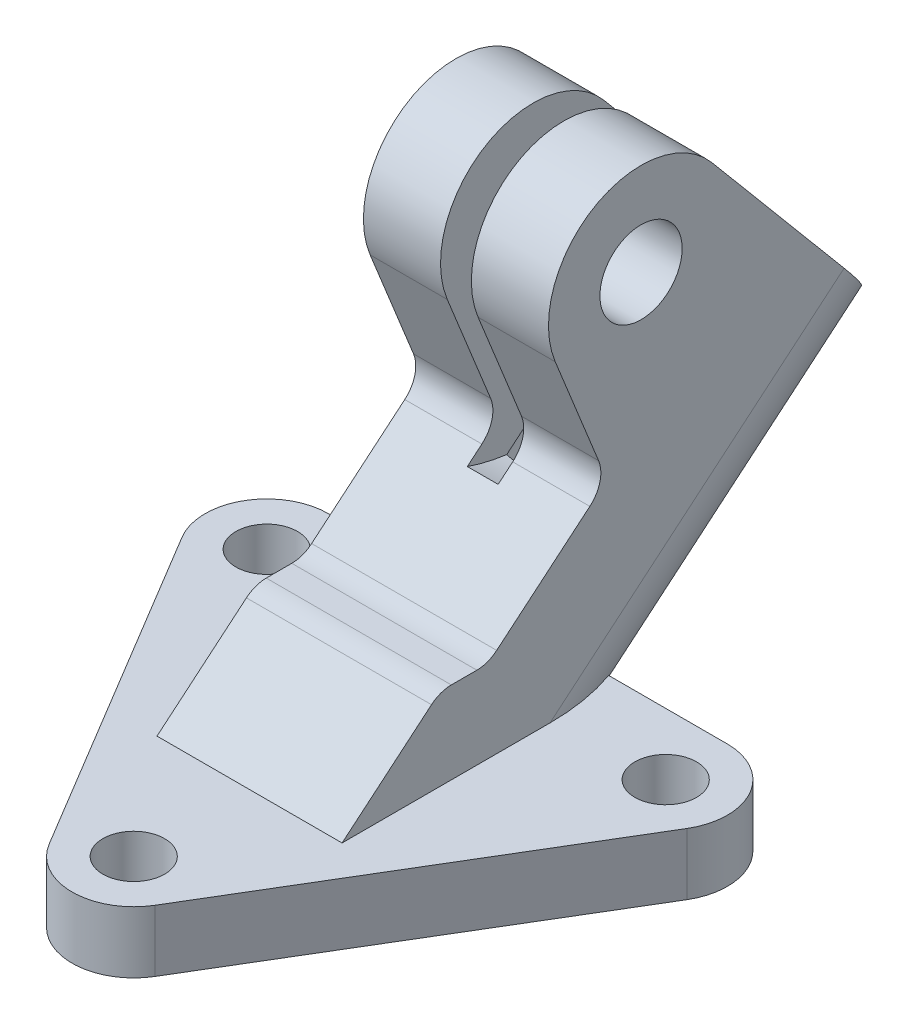
ISO-10303-21;
HEADER;
FILE_DESCRIPTION(('STEP AP214'),'2;1');
FILE_NAME('part.step','',(''),(''),'','','');
FILE_SCHEMA(('AUTOMOTIVE_DESIGN { 1 0 10303 214 1 1 1 1 }'));
ENDSEC;
DATA;
#1=APPLICATION_CONTEXT('core data for automotive mechanical design processes');
#2=APPLICATION_PROTOCOL_DEFINITION('international standard','automotive_design',2000,#1);
#3=PRODUCT_CONTEXT('',#1,'mechanical');
#4=PRODUCT('Part','Part','',(#3));
#5=PRODUCT_RELATED_PRODUCT_CATEGORY('part','',(#4));
#6=PRODUCT_DEFINITION_FORMATION('','',#4);
#7=PRODUCT_DEFINITION_CONTEXT('part definition',#1,'design');
#8=PRODUCT_DEFINITION('design','',#6,#7);
#9=PRODUCT_DEFINITION_SHAPE('','',#8);
#10=(LENGTH_UNIT() NAMED_UNIT(*) SI_UNIT(.MILLI.,.METRE.));
#11=(NAMED_UNIT(*) PLANE_ANGLE_UNIT() SI_UNIT($,.RADIAN.));
#12=(NAMED_UNIT(*) SI_UNIT($,.STERADIAN.) SOLID_ANGLE_UNIT());
#13=UNCERTAINTY_MEASURE_WITH_UNIT(LENGTH_MEASURE(1.E-05),#10,'distance_accuracy_value','');
#14=(GEOMETRIC_REPRESENTATION_CONTEXT(3) GLOBAL_UNCERTAINTY_ASSIGNED_CONTEXT((#13)) GLOBAL_UNIT_ASSIGNED_CONTEXT((#10,
#11,#12)) REPRESENTATION_CONTEXT('',''));
#15=CARTESIAN_POINT('',(0.,0.,0.));
#16=DIRECTION('',(0.,0.,1.));
#17=DIRECTION('',(1.,0.,0.));
#18=AXIS2_PLACEMENT_3D('',#15,#16,#17);
#19=CARTESIAN_POINT('',(9.,23.1056000119292,-52.5361818232617));
#20=DIRECTION('',(0.,-0.642787609686535,0.766044443118982));
#21=DIRECTION('',(0.,-0.766044443118982,-0.642787609686535));
#22=AXIS2_PLACEMENT_3D('',#19,#20,#21);
#23=PLANE('',#22);
#24=DIRECTION('',(0.,0.766044443118982,0.642787609686535));
#25=VECTOR('',#24,1.);
#26=CARTESIAN_POINT('',(-1.5,23.1056000119292,-52.5361818232617));
#27=LINE('',#26,#25);
#28=CARTESIAN_POINT('',(-1.5,35.2377501040967,-42.3560991555367));
#29=VERTEX_POINT('',#28);
#30=CARTESIAN_POINT('',(-1.5,45.3208888623796,-33.8953411423522));
#31=VERTEX_POINT('',#30);
#32=EDGE_CURVE('E251',#29,#31,#27,.T.);
#33=ORIENTED_EDGE('',*,*,#32,.F.);
#34=CARTESIAN_POINT('',(0.,30.,-46.7510933360829));
#35=DIRECTION('',(0.,0.642787609686535,-0.766044443118981));
#36=DIRECTION('',(0.,0.766044443118981,0.642787609686535));
#37=AXIS2_PLACEMENT_3D('',#34,#35,#36);
#38=CIRCLE('',#37,7.00000000000001);
#39=CARTESIAN_POINT('',(1.5,35.2377501040967,-42.3560991555367));
#40=VERTEX_POINT('',#39);
#41=EDGE_CURVE('E281',#40,#29,#38,.T.);
#42=ORIENTED_EDGE('',*,*,#41,.F.);
#43=DIRECTION('',(0.,0.766044443118982,0.642787609686535));
#44=VECTOR('',#43,1.);
#45=CARTESIAN_POINT('',(1.5,23.1056000119292,-52.5361818232617));
#46=LINE('',#45,#44);
#47=CARTESIAN_POINT('',(1.5,45.3208888623796,-33.8953411423522));
#48=VERTEX_POINT('',#47);
#49=EDGE_CURVE('E62',#40,#48,#46,.T.);
#50=ORIENTED_EDGE('',*,*,#49,.T.);
#51=DIRECTION('',(-1.,0.,0.));
#52=VECTOR('',#51,1.);
#53=CARTESIAN_POINT('',(9.,45.3208888623796,-33.8953411423522));
#54=LINE('',#53,#52);
#55=CARTESIAN_POINT('',(9.,45.3208888623796,-33.8953411423522));
#56=VERTEX_POINT('',#55);
#57=EDGE_CURVE('E384',#56,#48,#54,.T.);
#58=ORIENTED_EDGE('',*,*,#57,.F.);
#59=DIRECTION('',(0.,0.766044443118982,0.642787609686535));
#60=VECTOR('',#59,1.);
#61=CARTESIAN_POINT('',(9.,23.1056000119292,-52.5361818232617));
#62=LINE('',#61,#60);
#63=CARTESIAN_POINT('',(9.,30.,-46.7510933360829));
#64=VERTEX_POINT('',#63);
#65=EDGE_CURVE('E295',#64,#56,#62,.T.);
#66=ORIENTED_EDGE('',*,*,#65,.F.);
#67=CARTESIAN_POINT('',(0.,30.,-46.7510933360829));
#68=DIRECTION('',(0.,-0.642787609686535,0.766044443118982));
#69=DIRECTION('',(0.,-0.766044443118982,-0.642787609686535));
#70=AXIS2_PLACEMENT_3D('',#67,#68,#69);
#71=CIRCLE('',#70,9.);
#72=CARTESIAN_POINT('',(-9.,30.,-46.7510933360829));
#73=VERTEX_POINT('',#72);
#74=EDGE_CURVE('E495',#64,#73,#71,.F.);
#75=ORIENTED_EDGE('',*,*,#74,.T.);
#76=DIRECTION('',(0.,0.766044443118982,0.642787609686535));
#77=VECTOR('',#76,1.);
#78=CARTESIAN_POINT('',(-9.,23.1056000119292,-52.5361818232617));
#79=LINE('',#78,#77);
#80=CARTESIAN_POINT('',(-9.,45.3208888623796,-33.8953411423522));
#81=VERTEX_POINT('',#80);
#82=EDGE_CURVE('E290',#73,#81,#79,.T.);
#83=ORIENTED_EDGE('',*,*,#82,.T.);
#84=EDGE_CURVE('E383',#31,#81,#54,.T.);
#85=ORIENTED_EDGE('',*,*,#84,.F.);
#86=EDGE_LOOP('',(#33,#42,#50,#58,#66,#75,#83,#85));
#87=FACE_BOUND('',#86,.T.);
#88=ADVANCED_FACE('F45',(#87),#23,.F.);
#89=CARTESIAN_POINT('',(9.,39.5358003752008,-27.0009411542814));
#90=DIRECTION('',(-1.,0.,0.));
#91=DIRECTION('',(0.,0.,1.));
#92=AXIS2_PLACEMENT_3D('',#89,#90,#91);
#93=CYLINDRICAL_SURFACE('',#92,9.00000000000001);
#94=CARTESIAN_POINT('',(-1.5,39.5358003752008,-27.0009411542814));
#95=DIRECTION('',(1.,0.,0.));
#96=DIRECTION('',(0.,0.,-1.));
#97=AXIS2_PLACEMENT_3D('',#94,#95,#96);
#98=CIRCLE('',#97,9.00000000000001);
#99=CARTESIAN_POINT('',(-1.5,36.1643410344576,-18.6562864631803));
#100=VERTEX_POINT('',#99);
#101=EDGE_CURVE('E259',#31,#100,#98,.T.);
#102=ORIENTED_EDGE('',*,*,#101,.F.);
#103=ORIENTED_EDGE('',*,*,#84,.T.);
#104=CARTESIAN_POINT('',(-9.,39.5358003752008,-27.0009411542814));
#105=DIRECTION('',(1.,0.,0.));
#106=DIRECTION('',(0.,0.,-1.));
#107=AXIS2_PLACEMENT_3D('',#104,#105,#106);
#108=CIRCLE('',#107,9.00000000000001);
#109=CARTESIAN_POINT('',(-9.,36.1643410344576,-18.6562864631803));
#110=VERTEX_POINT('',#109);
#111=EDGE_CURVE('E328',#81,#110,#108,.T.);
#112=ORIENTED_EDGE('',*,*,#111,.T.);
#113=DIRECTION('',(-1.,0.,0.));
#114=VECTOR('',#113,1.);
#115=CARTESIAN_POINT('',(9.,36.1643410344576,-18.6562864631803));
#116=LINE('',#115,#114);
#117=EDGE_CURVE('E378',#100,#110,#116,.T.);
#118=ORIENTED_EDGE('',*,*,#117,.F.);
#119=EDGE_LOOP('',(#102,#103,#112,#118));
#120=FACE_BOUND('',#119,.T.);
#121=ADVANCED_FACE('F547',(#120),#93,.T.);
#122=CARTESIAN_POINT('',(9.,25.7249258919187,-22.8740839631466));
#123=DIRECTION('',(0.,0.37460659341591,-0.927183854566788));
#124=DIRECTION('',(0.,0.927183854566788,0.37460659341591));
#125=AXIS2_PLACEMENT_3D('',#122,#123,#124);
#126=PLANE('',#125);
#127=DIRECTION('',(0.,-0.927183854566788,-0.37460659341591));
#128=VECTOR('',#127,1.);
#129=CARTESIAN_POINT('',(-1.5,25.7249258919187,-22.8740839631466));
#130=LINE('',#129,#128);
#131=CARTESIAN_POINT('',(-1.5,25.7249258919187,-22.8740839631466));
#132=VERTEX_POINT('',#131);
#133=EDGE_CURVE('E262',#100,#132,#130,.T.);
#134=ORIENTED_EDGE('',*,*,#133,.F.);
#135=ORIENTED_EDGE('',*,*,#117,.T.);
#136=DIRECTION('',(0.,-0.927183854566788,-0.37460659341591));
#137=VECTOR('',#136,1.);
#138=CARTESIAN_POINT('',(-9.,25.7249258919187,-22.8740839631466));
#139=LINE('',#138,#137);
#140=CARTESIAN_POINT('',(-9.,25.7249258919187,-22.8740839631466));
#141=VERTEX_POINT('',#140);
#142=EDGE_CURVE('E332',#110,#141,#139,.T.);
#143=ORIENTED_EDGE('',*,*,#142,.T.);
#144=DIRECTION('',(-1.,0.,0.));
#145=VECTOR('',#144,1.);
#146=CARTESIAN_POINT('',(9.,25.7249258919187,-22.8740839631466));
#147=LINE('',#146,#145);
#148=EDGE_CURVE('E373',#132,#141,#147,.T.);
#149=ORIENTED_EDGE('',*,*,#148,.F.);
#150=EDGE_LOOP('',(#134,#135,#143,#149));
#151=FACE_BOUND('',#150,.T.);
#152=ADVANCED_FACE('F553',(#151),#126,.F.);
#153=CARTESIAN_POINT('',(9.,24.601106111671,-20.0925323994463));
#154=DIRECTION('',(-1.,0.,0.));
#155=DIRECTION('',(0.,0.,1.));
#156=AXIS2_PLACEMENT_3D('',#153,#154,#155);
#157=CYLINDRICAL_SURFACE('',#156,3.);
#158=CARTESIAN_POINT('',(-1.5,24.601106111671,-20.0925323994463));
#159=DIRECTION('',(1.,0.,0.));
#160=DIRECTION('',(0.,0.,-1.));
#161=AXIS2_PLACEMENT_3D('',#158,#159,#160);
#162=CIRCLE('',#161,3.);
#163=CARTESIAN_POINT('',(-1.5,22.302972782314,-22.0208952285059));
#164=VERTEX_POINT('',#163);
#165=EDGE_CURVE('E265',#132,#164,#162,.F.);
#166=ORIENTED_EDGE('',*,*,#165,.F.);
#167=ORIENTED_EDGE('',*,*,#148,.T.);
#168=CARTESIAN_POINT('',(-9.,24.601106111671,-20.0925323994463));
#169=DIRECTION('',(-1.,0.,0.));
#170=DIRECTION('',(0.,0.,-1.));
#171=AXIS2_PLACEMENT_3D('',#168,#169,#170);
#172=CIRCLE('',#171,3.);
#173=CARTESIAN_POINT('',(-9.,22.302972782314,-22.0208952285059));
#174=VERTEX_POINT('',#173);
#175=EDGE_CURVE('E336',#141,#174,#172,.T.);
#176=ORIENTED_EDGE('',*,*,#175,.T.);
#177=DIRECTION('',(-1.,0.,0.));
#178=VECTOR('',#177,1.);
#179=CARTESIAN_POINT('',(9.,22.302972782314,-22.0208952285059));
#180=LINE('',#179,#178);
#181=EDGE_CURVE('E370',#164,#174,#180,.T.);
#182=ORIENTED_EDGE('',*,*,#181,.F.);
#183=EDGE_LOOP('',(#166,#167,#176,#182));
#184=FACE_BOUND('',#183,.T.);
#185=ADVANCED_FACE('F657',(#184),#157,.F.);
#186=CARTESIAN_POINT('',(9.,14.7018666706431,-12.9622497122321));
#187=DIRECTION('',(0.,-0.766044443118981,-0.642787609686535));
#188=DIRECTION('',(0.,0.642787609686535,-0.766044443118981));
#189=AXIS2_PLACEMENT_3D('',#186,#187,#188);
#190=PLANE('',#189);
#191=DIRECTION('',(0.,-0.642787609686535,0.766044443118981));
#192=VECTOR('',#191,1.);
#193=CARTESIAN_POINT('',(-1.5,14.7018666706431,-12.9622497122321));
#194=LINE('',#193,#192);
#195=CARTESIAN_POINT('',(-1.5,21.114661305447,-20.6047207568287));
#196=VERTEX_POINT('',#195);
#197=EDGE_CURVE('E268',#164,#196,#194,.T.);
#198=ORIENTED_EDGE('',*,*,#197,.F.);
#199=ORIENTED_EDGE('',*,*,#181,.T.);
#200=DIRECTION('',(0.,-0.642787609686535,0.766044443118981));
#201=VECTOR('',#200,1.);
#202=CARTESIAN_POINT('',(-9.,14.7018666706431,-12.9622497122321));
#203=LINE('',#202,#201);
#204=CARTESIAN_POINT('',(-9.,14.7018666706431,-12.9622497122321));
#205=VERTEX_POINT('',#204);
#206=EDGE_CURVE('E340',#174,#205,#203,.T.);
#207=ORIENTED_EDGE('',*,*,#206,.T.);
#208=DIRECTION('',(-1.,0.,0.));
#209=VECTOR('',#208,1.);
#210=CARTESIAN_POINT('',(9.,14.7018666706431,-12.9622497122321));
#211=LINE('',#210,#209);
#212=CARTESIAN_POINT('',(9.,14.7018666706431,-12.9622497122321));
#213=VERTEX_POINT('',#212);
#214=EDGE_CURVE('E366',#213,#205,#211,.T.);
#215=ORIENTED_EDGE('',*,*,#214,.F.);
#216=DIRECTION('',(0.,-0.642787609686535,0.766044443118981));
#217=VECTOR('',#216,1.);
#218=CARTESIAN_POINT('',(9.,14.7018666706431,-12.9622497122321));
#219=LINE('',#218,#217);
#220=CARTESIAN_POINT('',(9.,22.302972782314,-22.0208952285059));
#221=VERTEX_POINT('',#220);
#222=EDGE_CURVE('E308',#221,#213,#219,.T.);
#223=ORIENTED_EDGE('',*,*,#222,.F.);
#224=CARTESIAN_POINT('',(1.5,22.302972782314,-22.0208952285059));
#225=VERTEX_POINT('',#224);
#226=EDGE_CURVE('E243',#221,#225,#180,.T.);
#227=ORIENTED_EDGE('',*,*,#226,.T.);
#228=DIRECTION('',(0.,-0.642787609686535,0.766044443118981));
#229=VECTOR('',#228,1.);
#230=CARTESIAN_POINT('',(1.5,14.7018666706431,-12.9622497122321));
#231=LINE('',#230,#229);
#232=CARTESIAN_POINT('',(1.5,21.114661305447,-20.6047207568287));
#233=VERTEX_POINT('',#232);
#234=EDGE_CURVE('E234',#225,#233,#231,.T.);
#235=ORIENTED_EDGE('',*,*,#234,.T.);
#236=DIRECTION('',(1.,0.,0.));
#237=VECTOR('',#236,1.);
#238=CARTESIAN_POINT('',(-1.5,21.114661305447,-20.6047207568287));
#239=LINE('',#238,#237);
#240=EDGE_CURVE('E219',#233,#196,#239,.F.);
#241=ORIENTED_EDGE('',*,*,#240,.T.);
#242=EDGE_LOOP('',(#198,#199,#207,#215,#223,#227,#235,#241));
#243=FACE_BOUND('',#242,.T.);
#244=ADVANCED_FACE('F240',(#243),#190,.F.);
#245=CARTESIAN_POINT('',(9.,39.5358003752008,-27.0009411542814));
#246=DIRECTION('',(-1.,0.,0.));
#247=DIRECTION('',(0.,0.,1.));
#248=AXIS2_PLACEMENT_3D('',#245,#246,#247);
#249=CYLINDRICAL_SURFACE('',#248,4.);
#250=CARTESIAN_POINT('',(-9.,39.5358003752008,-27.0009411542814));
#251=DIRECTION('',(1.,0.,0.));
#252=DIRECTION('',(0.,0.,-1.));
#253=AXIS2_PLACEMENT_3D('',#250,#251,#252);
#254=CIRCLE('',#253,4.);
#255=CARTESIAN_POINT('',(-9.,39.5358003752008,-31.0009411542814));
#256=VERTEX_POINT('',#255);
#257=EDGE_CURVE('E291',#256,#256,#254,.T.);
#258=ORIENTED_EDGE('',*,*,#257,.F.);
#259=EDGE_LOOP('',(#258));
#260=FACE_BOUND('',#259,.T.);
#261=CARTESIAN_POINT('',(-1.5,39.5358003752008,-27.0009411542814));
#262=DIRECTION('',(1.,0.,0.));
#263=DIRECTION('',(0.,0.,-1.));
#264=AXIS2_PLACEMENT_3D('',#261,#262,#263);
#265=CIRCLE('',#264,4.);
#266=CARTESIAN_POINT('',(-1.5,39.5358003752008,-31.0009411542814));
#267=VERTEX_POINT('',#266);
#268=EDGE_CURVE('E231',#267,#267,#265,.T.);
#269=ORIENTED_EDGE('',*,*,#268,.T.);
#270=EDGE_LOOP('',(#269));
#271=FACE_BOUND('',#270,.T.);
#272=ADVANCED_FACE('F544',(#260,#271),#249,.F.);
#273=CARTESIAN_POINT('',(0.,30.,-46.7510933360829));
#274=DIRECTION('',(0.,0.642787609686535,-0.766044443118981));
#275=DIRECTION('',(0.,0.766044443118981,0.642787609686535));
#276=AXIS2_PLACEMENT_3D('',#273,#274,#275);
#277=CYLINDRICAL_SURFACE('',#276,7.00000000000001);
#278=CARTESIAN_POINT('',(0.,12.001946928777,-25.3018489287514));
#279=DIRECTION('',(0.,0.642787609686535,-0.766044443118981));
#280=DIRECTION('',(0.,0.766044443118981,0.642787609686535));
#281=AXIS2_PLACEMENT_3D('',#278,#279,#280);
#282=CIRCLE('',#281,7.00000000000001);
#283=CARTESIAN_POINT('',(0.,17.3642580306099,-20.8023356609457));
#284=VERTEX_POINT('',#283);
#285=EDGE_CURVE('E277',#284,#284,#282,.T.);
#286=ORIENTED_EDGE('',*,*,#285,.F.);
#287=EDGE_LOOP('',(#286));
#288=FACE_BOUND('',#287,.T.);
#289=ORIENTED_EDGE('',*,*,#41,.T.);
#290=DIRECTION('',(0.,0.642787609686535,-0.766044443118981));
#291=VECTOR('',#290,1.);
#292=CARTESIAN_POINT('',(-1.5,35.2377501040967,-42.3560991555367));
#293=LINE('',#292,#291);
#294=CARTESIAN_POINT('',(-1.5,20.2046502596904,-24.4403484081379));
#295=VERTEX_POINT('',#294);
#296=EDGE_CURVE('E11',#29,#295,#293,.F.);
#297=ORIENTED_EDGE('',*,*,#296,.T.);
#298=CARTESIAN_POINT('',(1.5,20.2046502596904,-24.4403484081379));
#299=CARTESIAN_POINT('',(1.35649300963797,20.2102686938941,-24.3980209793938));
#300=CARTESIAN_POINT('',(1.2111738094031,20.2152072834523,-24.3617207139304));
#301=CARTESIAN_POINT('',(0.917919118718941,20.2235282210851,-24.3014611014906));
#302=CARTESIAN_POINT('',(0.769982993035216,20.2269101857676,-24.2775047946223));
#303=CARTESIAN_POINT('',(0.476130301426323,20.2318584791996,-24.2426624629187));
#304=CARTESIAN_POINT('',(0.330250038755619,20.2334662921353,-24.2314775816464));
#305=CARTESIAN_POINT('',(0.0381257887681329,20.2349347260064,-24.2212633107488));
#306=CARTESIAN_POINT('',(-0.108118069761016,20.2347958961488,-24.2222301002029));
#307=CARTESIAN_POINT('',(-0.463171276615558,20.2323314232577,-24.2393745427352));
#308=CARTESIAN_POINT('',(-0.671715106436237,20.2290869471573,-24.2619431323575));
#309=CARTESIAN_POINT('',(-0.983043831637065,20.2217420735661,-24.3144117393927));
#310=CARTESIAN_POINT('',(-1.08747754328256,20.2188442319732,-24.3352703142234));
#311=CARTESIAN_POINT('',(-1.29490061193122,20.2122927574933,-24.3831888293758));
#312=CARTESIAN_POINT('',(-1.39788981561516,20.2086390450171,-24.4102494227689));
#313=CARTESIAN_POINT('',(-1.5,20.2046502596904,-24.4403484081379));
#314=B_SPLINE_CURVE_WITH_KNOTS('',3,(#298,#299,#300,#301,#302,#303,#304,#305,#306,#307,#308,
#309,#310,#311,#312,#313),.UNSPECIFIED.,.F.,.F.,(4,2,2,2,2,2,2,4),(0.,0.44905238401112,
0.898215309230937,1.3366371846338,1.77492120794902,2.40255214814814,2.72199813704285,
3.04147777900599),.UNSPECIFIED.);
#315=CARTESIAN_POINT('',(1.5,20.2046502596904,-24.4403484081379));
#316=VERTEX_POINT('',#315);
#317=EDGE_CURVE('E55',#316,#295,#314,.T.);
#318=ORIENTED_EDGE('',*,*,#317,.F.);
#319=DIRECTION('',(0.,0.642787609686535,-0.766044443118981));
#320=VECTOR('',#319,1.);
#321=CARTESIAN_POINT('',(1.5,35.2377501040967,-42.3560991555367));
#322=LINE('',#321,#320);
#323=EDGE_CURVE('E236',#40,#316,#322,.F.);
#324=ORIENTED_EDGE('',*,*,#323,.F.);
#325=EDGE_LOOP('',(#289,#297,#318,#324));
#326=FACE_BOUND('',#325,.T.);
#327=ADVANCED_FACE('F522',(#288,#326),#277,.F.);
#328=CARTESIAN_POINT('',(0.,6.,-18.1490071138215));
#329=DIRECTION('',(0.,0.642787609686535,-0.766044443118982));
#330=DIRECTION('',(0.,0.766044443118981,0.642787609686535));
#331=AXIS2_PLACEMENT_3D('',#328,#329,#330);
#332=CYLINDRICAL_SURFACE('',#331,9.);
#333=CARTESIAN_POINT('',(0.,6.,-18.1490071138215));
#334=DIRECTION('',(0.,-1.,0.));
#335=DIRECTION('',(0.,0.,-1.));
#336=AXIS2_PLACEMENT_3D('',#333,#334,#335);
#337=ELLIPSE('',#336,14.0015144417438,9.);
#338=CARTESIAN_POINT('',(-9.,6.,-18.1490071138215));
#339=VERTEX_POINT('',#338);
#340=CARTESIAN_POINT('',(-7.8490211274302,6.00000000000008,-25.));
#341=VERTEX_POINT('',#340);
#342=EDGE_CURVE('E504',#339,#341,#337,.T.);
#343=ORIENTED_EDGE('',*,*,#342,.F.);
#344=DIRECTION('',(0.,-0.642787609686535,0.766044443118982));
#345=VECTOR('',#344,1.);
#346=CARTESIAN_POINT('',(-9.,6.,-18.1490071138215));
#347=LINE('',#346,#345);
#348=EDGE_CURVE('E491',#73,#339,#347,.T.);
#349=ORIENTED_EDGE('',*,*,#348,.F.);
#350=ORIENTED_EDGE('',*,*,#74,.F.);
#351=DIRECTION('',(0.,0.642787609686535,-0.766044443118982));
#352=VECTOR('',#351,1.);
#353=CARTESIAN_POINT('',(9.,3.33955556881019,-14.9784129050538));
#354=LINE('',#353,#352);
#355=CARTESIAN_POINT('',(9.,6.,-18.1490071138215));
#356=VERTEX_POINT('',#355);
#357=EDGE_CURVE('E487',#356,#64,#354,.T.);
#358=ORIENTED_EDGE('',*,*,#357,.F.);
#359=CARTESIAN_POINT('',(0.,6.,-18.1490071138215));
#360=DIRECTION('',(0.,-1.,0.));
#361=DIRECTION('',(0.,0.,-1.));
#362=AXIS2_PLACEMENT_3D('',#359,#360,#361);
#363=ELLIPSE('',#362,14.0015144417438,9.);
#364=CARTESIAN_POINT('',(7.84902112743019,6.,-24.9999999999999));
#365=VERTEX_POINT('',#364);
#366=EDGE_CURVE('E498',#365,#356,#363,.T.);
#367=ORIENTED_EDGE('',*,*,#366,.F.);
#368=CARTESIAN_POINT('',(0.,11.7486656039904,-25.));
#369=DIRECTION('',(0.,0.,1.));
#370=DIRECTION('',(0.,1.,0.));
#371=AXIS2_PLACEMENT_3D('',#368,#369,#370);
#372=ELLIPSE('',#371,11.7486656039905,9.);
#373=CARTESIAN_POINT('',(0.,0.,-25.));
#374=VERTEX_POINT('',#373);
#375=EDGE_CURVE('E507',#365,#374,#372,.F.);
#376=ORIENTED_EDGE('',*,*,#375,.T.);
#377=CARTESIAN_POINT('',(0.,11.7486656039904,-25.));
#378=DIRECTION('',(0.,0.,1.));
#379=DIRECTION('',(0.,1.,0.));
#380=AXIS2_PLACEMENT_3D('',#377,#378,#379);
#381=ELLIPSE('',#380,11.7486656039905,9.);
#382=EDGE_CURVE('E501',#341,#374,#381,.T.);
#383=ORIENTED_EDGE('',*,*,#382,.F.);
#384=EDGE_LOOP('',(#343,#349,#350,#358,#367,#376,#383));
#385=FACE_BOUND('',#384,.T.);
#386=ADVANCED_FACE('F48',(#385),#332,.T.);
#387=CARTESIAN_POINT('',(0.,6.,13.3380962103094));
#388=DIRECTION('',(0.,-1.,0.));
#389=DIRECTION('',(0.,0.,-1.));
#390=AXIS2_PLACEMENT_3D('',#387,#388,#389);
#391=PLANE('',#390);
#392=CARTESIAN_POINT('',(0.,6.,13.3380962103094));
#393=DIRECTION('',(0.,1.,0.));
#394=DIRECTION('',(0.,0.,1.));
#395=AXIS2_PLACEMENT_3D('',#392,#393,#394);
#396=CIRCLE('',#395,3.);
#397=CARTESIAN_POINT('',(0.,6.,16.3380962103094));
#398=VERTEX_POINT('',#397);
#399=EDGE_CURVE('E401',#398,#398,#396,.T.);
#400=ORIENTED_EDGE('',*,*,#399,.F.);
#401=EDGE_LOOP('',(#400));
#402=FACE_BOUND('',#401,.T.);
#403=CARTESIAN_POINT('',(19.4028577261856,6.,-19.));
#404=DIRECTION('',(0.,1.,0.));
#405=DIRECTION('',(0.,0.,1.));
#406=AXIS2_PLACEMENT_3D('',#403,#404,#405);
#407=CIRCLE('',#406,3.);
#408=CARTESIAN_POINT('',(19.4028577261856,6.,-16.));
#409=VERTEX_POINT('',#408);
#410=EDGE_CURVE('E409',#409,#409,#407,.T.);
#411=ORIENTED_EDGE('',*,*,#410,.F.);
#412=EDGE_LOOP('',(#411));
#413=FACE_BOUND('',#412,.T.);
#414=CARTESIAN_POINT('',(-19.4028577261856,6.,-19.));
#415=DIRECTION('',(0.,1.,0.));
#416=DIRECTION('',(0.,0.,1.));
#417=AXIS2_PLACEMENT_3D('',#414,#415,#416);
#418=CIRCLE('',#417,3.);
#419=CARTESIAN_POINT('',(-19.4028577261856,6.,-16.));
#420=VERTEX_POINT('',#419);
#421=EDGE_CURVE('E417',#420,#420,#418,.T.);
#422=ORIENTED_EDGE('',*,*,#421,.F.);
#423=EDGE_LOOP('',(#422));
#424=FACE_BOUND('',#423,.T.);
#425=DIRECTION('',(0.,0.,-1.));
#426=VECTOR('',#425,1.);
#427=CARTESIAN_POINT('',(9.,6.,13.3380962103094));
#428=LINE('',#427,#426);
#429=CARTESIAN_POINT('',(9.,6.,2.07540263536394));
#430=VERTEX_POINT('',#429);
#431=EDGE_CURVE('E392',#430,#356,#428,.T.);
#432=ORIENTED_EDGE('',*,*,#431,.F.);
#433=DIRECTION('',(1.,0.,0.));
#434=VECTOR('',#433,1.);
#435=CARTESIAN_POINT('',(0.,6.,2.07540263536394));
#436=LINE('',#435,#434);
#437=CARTESIAN_POINT('',(-9.,6.,2.07540263536394));
#438=VERTEX_POINT('',#437);
#439=EDGE_CURVE('E396',#438,#430,#436,.T.);
#440=ORIENTED_EDGE('',*,*,#439,.F.);
#441=DIRECTION('',(0.,0.,-1.));
#442=VECTOR('',#441,1.);
#443=CARTESIAN_POINT('',(-9.,6.,13.3380962103094));
#444=LINE('',#443,#442);
#445=EDGE_CURVE('E388',#438,#339,#444,.T.);
#446=ORIENTED_EDGE('',*,*,#445,.T.);
#447=ORIENTED_EDGE('',*,*,#342,.T.);
#448=DIRECTION('',(-1.,0.,0.));
#449=VECTOR('',#448,1.);
#450=CARTESIAN_POINT('',(-19.4028577261856,6.,-25.));
#451=LINE('',#450,#449);
#452=CARTESIAN_POINT('',(-19.4028577261856,6.,-25.));
#453=VERTEX_POINT('',#452);
#454=EDGE_CURVE('E70',#341,#453,#451,.T.);
#455=ORIENTED_EDGE('',*,*,#454,.T.);
#456=CARTESIAN_POINT('',(-19.4028577261856,6.,-19.));
#457=DIRECTION('',(0.,1.,0.));
#458=DIRECTION('',(0.,0.,-1.));
#459=AXIS2_PLACEMENT_3D('',#456,#457,#458);
#460=CIRCLE('',#459,6.);
#461=CARTESIAN_POINT('',(-24.5478152804609,6.,-15.9130254674348));
#462=VERTEX_POINT('',#461);
#463=EDGE_CURVE('E439',#453,#462,#460,.T.);
#464=ORIENTED_EDGE('',*,*,#463,.T.);
#465=DIRECTION('',(0.514495755427527,0.,0.857492925712544));
#466=VECTOR('',#465,1.);
#467=CARTESIAN_POINT('',(-24.5478152804609,6.,-15.9130254674348));
#468=LINE('',#467,#466);
#469=CARTESIAN_POINT('',(-5.1449575542753,6.,16.4250707428745));
#470=VERTEX_POINT('',#469);
#471=EDGE_CURVE('E442',#462,#470,#468,.T.);
#472=ORIENTED_EDGE('',*,*,#471,.T.);
#473=CARTESIAN_POINT('',(0.,6.,13.3380962103094));
#474=DIRECTION('',(0.,1.,0.));
#475=DIRECTION('',(0.,0.,-1.));
#476=AXIS2_PLACEMENT_3D('',#473,#474,#475);
#477=CIRCLE('',#476,6.);
#478=CARTESIAN_POINT('',(5.14495755427531,6.,16.4250707428745));
#479=VERTEX_POINT('',#478);
#480=EDGE_CURVE('E425',#470,#479,#477,.T.);
#481=ORIENTED_EDGE('',*,*,#480,.T.);
#482=DIRECTION('',(0.514495755427526,0.,-0.857492925712544));
#483=VECTOR('',#482,1.);
#484=CARTESIAN_POINT('',(24.5478152804609,6.,-15.9130254674348));
#485=LINE('',#484,#483);
#486=CARTESIAN_POINT('',(24.5478152804609,6.,-15.9130254674348));
#487=VERTEX_POINT('',#486);
#488=EDGE_CURVE('E429',#479,#487,#485,.T.);
#489=ORIENTED_EDGE('',*,*,#488,.T.);
#490=CARTESIAN_POINT('',(19.4028577261856,6.,-19.));
#491=DIRECTION('',(0.,1.,0.));
#492=DIRECTION('',(0.,0.,-1.));
#493=AXIS2_PLACEMENT_3D('',#490,#491,#492);
#494=CIRCLE('',#493,6.);
#495=CARTESIAN_POINT('',(19.4028577261856,6.,-25.));
#496=VERTEX_POINT('',#495);
#497=EDGE_CURVE('E433',#487,#496,#494,.T.);
#498=ORIENTED_EDGE('',*,*,#497,.T.);
#499=EDGE_CURVE('E436',#496,#365,#451,.T.);
#500=ORIENTED_EDGE('',*,*,#499,.T.);
#501=ORIENTED_EDGE('',*,*,#366,.T.);
#502=EDGE_LOOP('',(#432,#440,#446,#447,#455,#464,#472,#481,#489,#498,#500,#501));
#503=FACE_BOUND('',#502,.T.);
#504=ADVANCED_FACE('F574',(#402,#413,#424,#503),#391,.F.);
#505=CARTESIAN_POINT('',(-19.4028577261856,6.,-25.));
#506=DIRECTION('',(0.,0.,1.));
#507=DIRECTION('',(1.,0.,0.));
#508=AXIS2_PLACEMENT_3D('',#505,#506,#507);
#509=PLANE('',#508);
#510=DIRECTION('',(-1.,0.,0.));
#511=VECTOR('',#510,1.);
#512=CARTESIAN_POINT('',(-19.4028577261856,0.,-25.));
#513=LINE('',#512,#511);
#514=CARTESIAN_POINT('',(19.4028577261856,0.,-25.));
#515=VERTEX_POINT('',#514);
#516=EDGE_CURVE('E456',#515,#374,#513,.T.);
#517=ORIENTED_EDGE('',*,*,#516,.T.);
#518=ORIENTED_EDGE('',*,*,#375,.F.);
#519=ORIENTED_EDGE('',*,*,#499,.F.);
#520=DIRECTION('',(0.,-1.,0.));
#521=VECTOR('',#520,1.);
#522=CARTESIAN_POINT('',(19.4028577261856,6.,-25.));
#523=LINE('',#522,#521);
#524=EDGE_CURVE('E475',#496,#515,#523,.T.);
#525=ORIENTED_EDGE('',*,*,#524,.T.);
#526=EDGE_LOOP('',(#517,#518,#519,#525));
#527=FACE_BOUND('',#526,.T.);
#528=ADVANCED_FACE('F577',(#527),#509,.F.);
#529=CARTESIAN_POINT('',(0.,0.,13.3380962103094));
#530=DIRECTION('',(0.,-1.,0.));
#531=DIRECTION('',(0.,0.,-1.));
#532=AXIS2_PLACEMENT_3D('',#529,#530,#531);
#533=PLANE('',#532);
#534=CARTESIAN_POINT('',(0.,0.,-10.9984855582562));
#535=DIRECTION('',(0.,-1.,0.));
#536=DIRECTION('',(0.,0.,-1.));
#537=AXIS2_PLACEMENT_3D('',#534,#535,#536);
#538=ELLIPSE('',#537,7.77861913430211,5.);
#539=CARTESIAN_POINT('',(0.,0.,-18.7771046925583));
#540=VERTEX_POINT('',#539);
#541=EDGE_CURVE('E285',#540,#540,#538,.F.);
#542=ORIENTED_EDGE('',*,*,#541,.T.);
#543=EDGE_LOOP('',(#542));
#544=FACE_BOUND('',#543,.T.);
#545=CARTESIAN_POINT('',(-19.4028577261856,0.,-25.));
#546=VERTEX_POINT('',#545);
#547=EDGE_CURVE('E455',#374,#546,#513,.T.);
#548=ORIENTED_EDGE('',*,*,#547,.F.);
#549=ORIENTED_EDGE('',*,*,#516,.F.);
#550=CARTESIAN_POINT('',(19.4028577261856,0.,-19.));
#551=DIRECTION('',(0.,1.,0.));
#552=DIRECTION('',(0.,0.,-1.));
#553=AXIS2_PLACEMENT_3D('',#550,#551,#552);
#554=CIRCLE('',#553,6.);
#555=CARTESIAN_POINT('',(24.5478152804609,0.,-15.9130254674348));
#556=VERTEX_POINT('',#555);
#557=EDGE_CURVE('E452',#556,#515,#554,.T.);
#558=ORIENTED_EDGE('',*,*,#557,.F.);
#559=DIRECTION('',(0.514495755427526,0.,-0.857492925712544));
#560=VECTOR('',#559,1.);
#561=CARTESIAN_POINT('',(24.5478152804609,0.,-15.9130254674348));
#562=LINE('',#561,#560);
#563=CARTESIAN_POINT('',(5.14495755427531,0.,16.4250707428745));
#564=VERTEX_POINT('',#563);
#565=EDGE_CURVE('E449',#564,#556,#562,.T.);
#566=ORIENTED_EDGE('',*,*,#565,.F.);
#567=CARTESIAN_POINT('',(0.,0.,13.3380962103094));
#568=DIRECTION('',(0.,1.,0.));
#569=DIRECTION('',(0.,0.,-1.));
#570=AXIS2_PLACEMENT_3D('',#567,#568,#569);
#571=CIRCLE('',#570,6.);
#572=CARTESIAN_POINT('',(-5.1449575542753,0.,16.4250707428745));
#573=VERTEX_POINT('',#572);
#574=EDGE_CURVE('E421',#573,#564,#571,.T.);
#575=ORIENTED_EDGE('',*,*,#574,.F.);
#576=DIRECTION('',(0.514495755427527,0.,0.857492925712544));
#577=VECTOR('',#576,1.);
#578=CARTESIAN_POINT('',(-24.5478152804609,0.,-15.9130254674348));
#579=LINE('',#578,#577);
#580=CARTESIAN_POINT('',(-24.5478152804609,0.,-15.9130254674348));
#581=VERTEX_POINT('',#580);
#582=EDGE_CURVE('E430',#581,#573,#579,.T.);
#583=ORIENTED_EDGE('',*,*,#582,.F.);
#584=CARTESIAN_POINT('',(-19.4028577261856,0.,-19.));
#585=DIRECTION('',(0.,1.,0.));
#586=DIRECTION('',(0.,0.,-1.));
#587=AXIS2_PLACEMENT_3D('',#584,#585,#586);
#588=CIRCLE('',#587,6.);
#589=EDGE_CURVE('E459',#546,#581,#588,.T.);
#590=ORIENTED_EDGE('',*,*,#589,.F.);
#591=EDGE_LOOP('',(#548,#549,#558,#566,#575,#583,#590));
#592=FACE_BOUND('',#591,.T.);
#593=CARTESIAN_POINT('',(19.4028577261856,0.,-19.));
#594=DIRECTION('',(0.,1.,0.));
#595=DIRECTION('',(0.,0.,1.));
#596=AXIS2_PLACEMENT_3D('',#593,#594,#595);
#597=CIRCLE('',#596,3.);
#598=CARTESIAN_POINT('',(19.4028577261856,0.,-16.));
#599=VERTEX_POINT('',#598);
#600=EDGE_CURVE('E405',#599,#599,#597,.T.);
#601=ORIENTED_EDGE('',*,*,#600,.T.);
#602=EDGE_LOOP('',(#601));
#603=FACE_BOUND('',#602,.T.);
#604=CARTESIAN_POINT('',(-19.4028577261856,0.,-19.));
#605=DIRECTION('',(0.,1.,0.));
#606=DIRECTION('',(0.,0.,1.));
#607=AXIS2_PLACEMENT_3D('',#604,#605,#606);
#608=CIRCLE('',#607,3.);
#609=CARTESIAN_POINT('',(-19.4028577261856,0.,-16.));
#610=VERTEX_POINT('',#609);
#611=EDGE_CURVE('E413',#610,#610,#608,.T.);
#612=ORIENTED_EDGE('',*,*,#611,.T.);
#613=EDGE_LOOP('',(#612));
#614=FACE_BOUND('',#613,.T.);
#615=CARTESIAN_POINT('',(0.,0.,13.3380962103094));
#616=DIRECTION('',(0.,1.,0.));
#617=DIRECTION('',(0.,0.,1.));
#618=AXIS2_PLACEMENT_3D('',#615,#616,#617);
#619=CIRCLE('',#618,3.);
#620=CARTESIAN_POINT('',(0.,0.,16.3380962103094));
#621=VERTEX_POINT('',#620);
#622=EDGE_CURVE('E400',#621,#621,#619,.T.);
#623=ORIENTED_EDGE('',*,*,#622,.T.);
#624=EDGE_LOOP('',(#623));
#625=FACE_BOUND('',#624,.T.);
#626=ADVANCED_FACE('F579',(#544,#592,#603,#614,#625),#533,.T.);
#627=CARTESIAN_POINT('',(0.,6.,13.3380962103094));
#628=DIRECTION('',(0.,-1.,0.));
#629=DIRECTION('',(0.,0.,-1.));
#630=AXIS2_PLACEMENT_3D('',#627,#628,#629);
#631=CYLINDRICAL_SURFACE('',#630,6.);
#632=ORIENTED_EDGE('',*,*,#574,.T.);
#633=DIRECTION('',(0.,-1.,0.));
#634=VECTOR('',#633,1.);
#635=CARTESIAN_POINT('',(5.14495755427531,6.,16.4250707428745));
#636=LINE('',#635,#634);
#637=EDGE_CURVE('E483',#479,#564,#636,.T.);
#638=ORIENTED_EDGE('',*,*,#637,.F.);
#639=ORIENTED_EDGE('',*,*,#480,.F.);
#640=DIRECTION('',(0.,-1.,0.));
#641=VECTOR('',#640,1.);
#642=CARTESIAN_POINT('',(-5.1449575542753,6.,16.4250707428745));
#643=LINE('',#642,#641);
#644=EDGE_CURVE('E445',#470,#573,#643,.T.);
#645=ORIENTED_EDGE('',*,*,#644,.T.);
#646=EDGE_LOOP('',(#632,#638,#639,#645));
#647=FACE_BOUND('',#646,.T.);
#648=ADVANCED_FACE('F582',(#647),#631,.T.);
#649=CARTESIAN_POINT('',(24.5478152804609,6.,-15.9130254674348));
#650=DIRECTION('',(-0.857492925712544,0.,-0.514495755427526));
#651=DIRECTION('',(-0.514495755427526,0.,0.857492925712544));
#652=AXIS2_PLACEMENT_3D('',#649,#650,#651);
#653=PLANE('',#652);
#654=ORIENTED_EDGE('',*,*,#565,.T.);
#655=DIRECTION('',(0.,-1.,0.));
#656=VECTOR('',#655,1.);
#657=CARTESIAN_POINT('',(24.5478152804609,6.,-15.9130254674348));
#658=LINE('',#657,#656);
#659=EDGE_CURVE('E479',#487,#556,#658,.T.);
#660=ORIENTED_EDGE('',*,*,#659,.F.);
#661=ORIENTED_EDGE('',*,*,#488,.F.);
#662=ORIENTED_EDGE('',*,*,#637,.T.);
#663=EDGE_LOOP('',(#654,#660,#661,#662));
#664=FACE_BOUND('',#663,.T.);
#665=ADVANCED_FACE('F597',(#664),#653,.F.);
#666=CARTESIAN_POINT('',(19.4028577261856,6.,-19.));
#667=DIRECTION('',(0.,-1.,0.));
#668=DIRECTION('',(0.,0.,-1.));
#669=AXIS2_PLACEMENT_3D('',#666,#667,#668);
#670=CYLINDRICAL_SURFACE('',#669,6.);
#671=ORIENTED_EDGE('',*,*,#557,.T.);
#672=ORIENTED_EDGE('',*,*,#524,.F.);
#673=ORIENTED_EDGE('',*,*,#497,.F.);
#674=ORIENTED_EDGE('',*,*,#659,.T.);
#675=EDGE_LOOP('',(#671,#672,#673,#674));
#676=FACE_BOUND('',#675,.T.);
#677=ADVANCED_FACE('F594',(#676),#670,.T.);
#678=ORIENTED_EDGE('',*,*,#454,.F.);
#679=ORIENTED_EDGE('',*,*,#382,.T.);
#680=ORIENTED_EDGE('',*,*,#547,.T.);
#681=DIRECTION('',(0.,-1.,0.));
#682=VECTOR('',#681,1.);
#683=CARTESIAN_POINT('',(-19.4028577261856,6.,-25.));
#684=LINE('',#683,#682);
#685=EDGE_CURVE('E471',#453,#546,#684,.T.);
#686=ORIENTED_EDGE('',*,*,#685,.F.);
#687=EDGE_LOOP('',(#678,#679,#680,#686));
#688=FACE_BOUND('',#687,.T.);
#689=ADVANCED_FACE('F590',(#688),#509,.F.);
#690=CARTESIAN_POINT('',(-19.4028577261856,6.,-19.));
#691=DIRECTION('',(0.,-1.,0.));
#692=DIRECTION('',(0.,0.,-1.));
#693=AXIS2_PLACEMENT_3D('',#690,#691,#692);
#694=CYLINDRICAL_SURFACE('',#693,6.);
#695=ORIENTED_EDGE('',*,*,#589,.T.);
#696=DIRECTION('',(0.,-1.,0.));
#697=VECTOR('',#696,1.);
#698=CARTESIAN_POINT('',(-24.5478152804609,6.,-15.9130254674348));
#699=LINE('',#698,#697);
#700=EDGE_CURVE('E467',#462,#581,#699,.T.);
#701=ORIENTED_EDGE('',*,*,#700,.F.);
#702=ORIENTED_EDGE('',*,*,#463,.F.);
#703=ORIENTED_EDGE('',*,*,#685,.T.);
#704=EDGE_LOOP('',(#695,#701,#702,#703));
#705=FACE_BOUND('',#704,.T.);
#706=ADVANCED_FACE('F586',(#705),#694,.T.);
#707=CARTESIAN_POINT('',(-24.5478152804609,6.,-15.9130254674348));
#708=DIRECTION('',(0.857492925712544,0.,-0.514495755427527));
#709=DIRECTION('',(-0.514495755427527,0.,-0.857492925712544));
#710=AXIS2_PLACEMENT_3D('',#707,#708,#709);
#711=PLANE('',#710);
#712=ORIENTED_EDGE('',*,*,#582,.T.);
#713=ORIENTED_EDGE('',*,*,#644,.F.);
#714=ORIENTED_EDGE('',*,*,#471,.F.);
#715=ORIENTED_EDGE('',*,*,#700,.T.);
#716=EDGE_LOOP('',(#712,#713,#714,#715));
#717=FACE_BOUND('',#716,.T.);
#718=ADVANCED_FACE('F572',(#717),#711,.F.);
#719=CARTESIAN_POINT('',(-19.4028577261856,6.,-19.));
#720=DIRECTION('',(0.,-1.,0.));
#721=DIRECTION('',(0.,0.,-1.));
#722=AXIS2_PLACEMENT_3D('',#719,#720,#721);
#723=CYLINDRICAL_SURFACE('',#722,3.);
#724=ORIENTED_EDGE('',*,*,#421,.T.);
#725=EDGE_LOOP('',(#724));
#726=FACE_BOUND('',#725,.T.);
#727=ORIENTED_EDGE('',*,*,#611,.F.);
#728=EDGE_LOOP('',(#727));
#729=FACE_BOUND('',#728,.T.);
#730=ADVANCED_FACE('F568',(#726,#729),#723,.F.);
#731=CARTESIAN_POINT('',(19.4028577261856,6.,-19.));
#732=DIRECTION('',(0.,-1.,0.));
#733=DIRECTION('',(0.,0.,-1.));
#734=AXIS2_PLACEMENT_3D('',#731,#732,#733);
#735=CYLINDRICAL_SURFACE('',#734,3.);
#736=ORIENTED_EDGE('',*,*,#410,.T.);
#737=EDGE_LOOP('',(#736));
#738=FACE_BOUND('',#737,.T.);
#739=ORIENTED_EDGE('',*,*,#600,.F.);
#740=EDGE_LOOP('',(#739));
#741=FACE_BOUND('',#740,.T.);
#742=ADVANCED_FACE('F564',(#738,#741),#735,.F.);
#743=CARTESIAN_POINT('',(0.,6.,13.3380962103094));
#744=DIRECTION('',(0.,-1.,0.));
#745=DIRECTION('',(0.,0.,-1.));
#746=AXIS2_PLACEMENT_3D('',#743,#744,#745);
#747=CYLINDRICAL_SURFACE('',#746,3.);
#748=ORIENTED_EDGE('',*,*,#399,.T.);
#749=EDGE_LOOP('',(#748));
#750=FACE_BOUND('',#749,.T.);
#751=ORIENTED_EDGE('',*,*,#622,.F.);
#752=EDGE_LOOP('',(#751));
#753=FACE_BOUND('',#752,.T.);
#754=ADVANCED_FACE('F560',(#750,#753),#747,.F.);
#755=CARTESIAN_POINT('',(9.,0.,9.22592419092928));
#756=DIRECTION('',(0.,-0.766044443118981,-0.642787609686535));
#757=DIRECTION('',(0.,0.642787609686535,-0.766044443118982));
#758=AXIS2_PLACEMENT_3D('',#755,#756,#757);
#759=PLANE('',#758);
#760=DIRECTION('',(0.,-0.642787609686535,0.766044443118981));
#761=VECTOR('',#760,1.);
#762=CARTESIAN_POINT('',(-9.,0.,9.22592419092928));
#763=LINE('',#762,#761);
#764=CARTESIAN_POINT('',(-9.,13.2981333293569,-6.62217397912882));
#765=VERTEX_POINT('',#764);
#766=EDGE_CURVE('E299',#765,#438,#763,.T.);
#767=ORIENTED_EDGE('',*,*,#766,.T.);
#768=ORIENTED_EDGE('',*,*,#439,.T.);
#769=DIRECTION('',(0.,-0.642787609686535,0.766044443118981));
#770=VECTOR('',#769,1.);
#771=CARTESIAN_POINT('',(9.,0.,9.22592419092928));
#772=LINE('',#771,#770);
#773=CARTESIAN_POINT('',(9.,13.2981333293569,-6.62217397912882));
#774=VERTEX_POINT('',#773);
#775=EDGE_CURVE('E320',#774,#430,#772,.T.);
#776=ORIENTED_EDGE('',*,*,#775,.F.);
#777=DIRECTION('',(-1.,0.,0.));
#778=VECTOR('',#777,1.);
#779=CARTESIAN_POINT('',(9.,13.2981333293569,-6.62217397912882));
#780=LINE('',#779,#778);
#781=EDGE_CURVE('E324',#774,#765,#780,.T.);
#782=ORIENTED_EDGE('',*,*,#781,.T.);
#783=EDGE_LOOP('',(#767,#768,#776,#782));
#784=FACE_BOUND('',#783,.T.);
#785=ADVANCED_FACE('F563',(#784),#759,.F.);
#786=CARTESIAN_POINT('',(9.,11.,-8.55053680818844));
#787=DIRECTION('',(-1.,0.,0.));
#788=DIRECTION('',(0.,0.,1.));
#789=AXIS2_PLACEMENT_3D('',#786,#787,#788);
#790=PLANE('',#789);
#791=CARTESIAN_POINT('',(9.,39.5358003752008,-27.0009411542814));
#792=DIRECTION('',(1.,0.,0.));
#793=DIRECTION('',(0.,0.,-1.));
#794=AXIS2_PLACEMENT_3D('',#791,#792,#793);
#795=CIRCLE('',#794,4.);
#796=CARTESIAN_POINT('',(9.,39.5358003752008,-31.0009411542814));
#797=VERTEX_POINT('',#796);
#798=EDGE_CURVE('E286',#797,#797,#795,.T.);
#799=ORIENTED_EDGE('',*,*,#798,.F.);
#800=EDGE_LOOP('',(#799));
#801=FACE_BOUND('',#800,.T.);
#802=ORIENTED_EDGE('',*,*,#431,.T.);
#803=ORIENTED_EDGE('',*,*,#357,.T.);
#804=ORIENTED_EDGE('',*,*,#65,.T.);
#805=CARTESIAN_POINT('',(9.,39.5358003752008,-27.0009411542814));
#806=DIRECTION('',(1.,0.,0.));
#807=DIRECTION('',(0.,0.,-1.));
#808=AXIS2_PLACEMENT_3D('',#805,#806,#807);
#809=CIRCLE('',#808,9.00000000000001);
#810=CARTESIAN_POINT('',(9.,36.1643410344576,-18.6562864631803));
#811=VERTEX_POINT('',#810);
#812=EDGE_CURVE('E298',#56,#811,#809,.T.);
#813=ORIENTED_EDGE('',*,*,#812,.T.);
#814=DIRECTION('',(0.,-0.927183854566788,-0.37460659341591));
#815=VECTOR('',#814,1.);
#816=CARTESIAN_POINT('',(9.,25.7249258919187,-22.8740839631466));
#817=LINE('',#816,#815);
#818=CARTESIAN_POINT('',(9.,25.7249258919187,-22.8740839631466));
#819=VERTEX_POINT('',#818);
#820=EDGE_CURVE('E302',#811,#819,#817,.T.);
#821=ORIENTED_EDGE('',*,*,#820,.T.);
#822=CARTESIAN_POINT('',(9.,24.601106111671,-20.0925323994463));
#823=DIRECTION('',(-1.,0.,0.));
#824=DIRECTION('',(0.,0.,-1.));
#825=AXIS2_PLACEMENT_3D('',#822,#823,#824);
#826=CIRCLE('',#825,3.);
#827=EDGE_CURVE('E305',#819,#221,#826,.T.);
#828=ORIENTED_EDGE('',*,*,#827,.T.);
#829=ORIENTED_EDGE('',*,*,#222,.T.);
#830=CARTESIAN_POINT('',(9.,17.,-11.0338868831725));
#831=DIRECTION('',(-1.,0.,0.));
#832=DIRECTION('',(0.,0.,-1.));
#833=AXIS2_PLACEMENT_3D('',#830,#831,#832);
#834=CIRCLE('',#833,3.);
#835=CARTESIAN_POINT('',(9.,14.,-11.0338868831725));
#836=VERTEX_POINT('',#835);
#837=EDGE_CURVE('E311',#213,#836,#834,.T.);
#838=ORIENTED_EDGE('',*,*,#837,.T.);
#839=DIRECTION('',(0.,0.,1.));
#840=VECTOR('',#839,1.);
#841=CARTESIAN_POINT('',(9.,14.,-8.55053680818845));
#842=LINE('',#841,#840);
#843=CARTESIAN_POINT('',(9.,14.,-8.55053680818845));
#844=VERTEX_POINT('',#843);
#845=EDGE_CURVE('E314',#836,#844,#842,.T.);
#846=ORIENTED_EDGE('',*,*,#845,.T.);
#847=CARTESIAN_POINT('',(9.,11.,-8.55053680818844));
#848=DIRECTION('',(1.,0.,0.));
#849=DIRECTION('',(0.,0.,1.));
#850=AXIS2_PLACEMENT_3D('',#847,#848,#849);
#851=CIRCLE('',#850,3.);
#852=EDGE_CURVE('E317',#844,#774,#851,.T.);
#853=ORIENTED_EDGE('',*,*,#852,.T.);
#854=ORIENTED_EDGE('',*,*,#775,.T.);
#855=EDGE_LOOP('',(#802,#803,#804,#813,#821,#828,#829,#838,#846,#853,#854));
#856=FACE_BOUND('',#855,.T.);
#857=ADVANCED_FACE('F634',(#801,#856),#790,.F.);
#858=CARTESIAN_POINT('',(-9.,11.,-8.55053680818844));
#859=DIRECTION('',(-1.,0.,0.));
#860=DIRECTION('',(0.,0.,1.));
#861=AXIS2_PLACEMENT_3D('',#858,#859,#860);
#862=PLANE('',#861);
#863=ORIENTED_EDGE('',*,*,#257,.T.);
#864=EDGE_LOOP('',(#863));
#865=FACE_BOUND('',#864,.T.);
#866=ORIENTED_EDGE('',*,*,#82,.F.);
#867=ORIENTED_EDGE('',*,*,#348,.T.);
#868=ORIENTED_EDGE('',*,*,#445,.F.);
#869=ORIENTED_EDGE('',*,*,#766,.F.);
#870=CARTESIAN_POINT('',(-9.,11.,-8.55053680818844));
#871=DIRECTION('',(1.,0.,0.));
#872=DIRECTION('',(0.,0.,1.));
#873=AXIS2_PLACEMENT_3D('',#870,#871,#872);
#874=CIRCLE('',#873,3.);
#875=CARTESIAN_POINT('',(-9.,14.,-8.55053680818845));
#876=VERTEX_POINT('',#875);
#877=EDGE_CURVE('E349',#876,#765,#874,.T.);
#878=ORIENTED_EDGE('',*,*,#877,.F.);
#879=DIRECTION('',(0.,0.,1.));
#880=VECTOR('',#879,1.);
#881=CARTESIAN_POINT('',(-9.,14.,-8.55053680818845));
#882=LINE('',#881,#880);
#883=CARTESIAN_POINT('',(-9.,14.,-11.0338868831725));
#884=VERTEX_POINT('',#883);
#885=EDGE_CURVE('E346',#884,#876,#882,.T.);
#886=ORIENTED_EDGE('',*,*,#885,.F.);
#887=CARTESIAN_POINT('',(-9.,17.,-11.0338868831725));
#888=DIRECTION('',(-1.,0.,0.));
#889=DIRECTION('',(0.,0.,-1.));
#890=AXIS2_PLACEMENT_3D('',#887,#888,#889);
#891=CIRCLE('',#890,3.);
#892=EDGE_CURVE('E343',#205,#884,#891,.T.);
#893=ORIENTED_EDGE('',*,*,#892,.F.);
#894=ORIENTED_EDGE('',*,*,#206,.F.);
#895=ORIENTED_EDGE('',*,*,#175,.F.);
#896=ORIENTED_EDGE('',*,*,#142,.F.);
#897=ORIENTED_EDGE('',*,*,#111,.F.);
#898=EDGE_LOOP('',(#866,#867,#868,#869,#878,#886,#893,#894,#895,#896,#897));
#899=FACE_BOUND('',#898,.T.);
#900=ADVANCED_FACE('F643',(#865,#899),#862,.T.);
#901=ORIENTED_EDGE('',*,*,#57,.T.);
#902=CARTESIAN_POINT('',(1.5,39.5358003752008,-27.0009411542814));
#903=DIRECTION('',(1.,0.,0.));
#904=DIRECTION('',(0.,0.,-1.));
#905=AXIS2_PLACEMENT_3D('',#902,#903,#904);
#906=CIRCLE('',#905,9.00000000000001);
#907=CARTESIAN_POINT('',(1.5,36.1643410344576,-18.6562864631803));
#908=VERTEX_POINT('',#907);
#909=EDGE_CURVE('E681',#48,#908,#906,.T.);
#910=ORIENTED_EDGE('',*,*,#909,.T.);
#911=EDGE_CURVE('E379',#811,#908,#116,.T.);
#912=ORIENTED_EDGE('',*,*,#911,.F.);
#913=ORIENTED_EDGE('',*,*,#812,.F.);
#914=EDGE_LOOP('',(#901,#910,#912,#913));
#915=FACE_BOUND('',#914,.T.);
#916=ADVANCED_FACE('F556',(#915),#93,.T.);
#917=ORIENTED_EDGE('',*,*,#911,.T.);
#918=DIRECTION('',(0.,-0.927183854566788,-0.37460659341591));
#919=VECTOR('',#918,1.);
#920=CARTESIAN_POINT('',(1.5,25.7249258919187,-22.8740839631466));
#921=LINE('',#920,#919);
#922=CARTESIAN_POINT('',(1.5,25.7249258919187,-22.8740839631466));
#923=VERTEX_POINT('',#922);
#924=EDGE_CURVE('E253',#908,#923,#921,.T.);
#925=ORIENTED_EDGE('',*,*,#924,.T.);
#926=EDGE_CURVE('E374',#819,#923,#147,.T.);
#927=ORIENTED_EDGE('',*,*,#926,.F.);
#928=ORIENTED_EDGE('',*,*,#820,.F.);
#929=EDGE_LOOP('',(#917,#925,#927,#928));
#930=FACE_BOUND('',#929,.T.);
#931=ADVANCED_FACE('F678',(#930),#126,.F.);
#932=ORIENTED_EDGE('',*,*,#926,.T.);
#933=CARTESIAN_POINT('',(1.5,24.601106111671,-20.0925323994463));
#934=DIRECTION('',(1.,0.,0.));
#935=DIRECTION('',(0.,0.,-1.));
#936=AXIS2_PLACEMENT_3D('',#933,#934,#935);
#937=CIRCLE('',#936,3.);
#938=EDGE_CURVE('E246',#923,#225,#937,.F.);
#939=ORIENTED_EDGE('',*,*,#938,.T.);
#940=ORIENTED_EDGE('',*,*,#226,.F.);
#941=ORIENTED_EDGE('',*,*,#827,.F.);
#942=EDGE_LOOP('',(#932,#939,#940,#941));
#943=FACE_BOUND('',#942,.T.);
#944=ADVANCED_FACE('F674',(#943),#157,.F.);
#945=CARTESIAN_POINT('',(9.,17.,-11.0338868831725));
#946=DIRECTION('',(-1.,0.,0.));
#947=DIRECTION('',(0.,0.,1.));
#948=AXIS2_PLACEMENT_3D('',#945,#946,#947);
#949=CYLINDRICAL_SURFACE('',#948,3.);
#950=ORIENTED_EDGE('',*,*,#892,.T.);
#951=DIRECTION('',(-1.,0.,0.));
#952=VECTOR('',#951,1.);
#953=CARTESIAN_POINT('',(9.,14.,-11.0338868831725));
#954=LINE('',#953,#952);
#955=EDGE_CURVE('E362',#836,#884,#954,.T.);
#956=ORIENTED_EDGE('',*,*,#955,.F.);
#957=ORIENTED_EDGE('',*,*,#837,.F.);
#958=ORIENTED_EDGE('',*,*,#214,.T.);
#959=EDGE_LOOP('',(#950,#956,#957,#958));
#960=FACE_BOUND('',#959,.T.);
#961=ADVANCED_FACE('F664',(#960),#949,.F.);
#962=CARTESIAN_POINT('',(9.,14.,-8.55053680818845));
#963=DIRECTION('',(0.,-1.,0.));
#964=DIRECTION('',(0.,0.,-1.));
#965=AXIS2_PLACEMENT_3D('',#962,#963,#964);
#966=PLANE('',#965);
#967=ORIENTED_EDGE('',*,*,#885,.T.);
#968=DIRECTION('',(-1.,0.,0.));
#969=VECTOR('',#968,1.);
#970=CARTESIAN_POINT('',(9.,14.,-8.55053680818845));
#971=LINE('',#970,#969);
#972=EDGE_CURVE('E358',#844,#876,#971,.T.);
#973=ORIENTED_EDGE('',*,*,#972,.F.);
#974=ORIENTED_EDGE('',*,*,#845,.F.);
#975=ORIENTED_EDGE('',*,*,#955,.T.);
#976=EDGE_LOOP('',(#967,#973,#974,#975));
#977=FACE_BOUND('',#976,.T.);
#978=ADVANCED_FACE('F668',(#977),#966,.F.);
#979=CARTESIAN_POINT('',(9.,11.,-8.55053680818844));
#980=DIRECTION('',(-1.,0.,0.));
#981=DIRECTION('',(0.,0.,1.));
#982=AXIS2_PLACEMENT_3D('',#979,#980,#981);
#983=CYLINDRICAL_SURFACE('',#982,3.);
#984=ORIENTED_EDGE('',*,*,#877,.T.);
#985=ORIENTED_EDGE('',*,*,#781,.F.);
#986=ORIENTED_EDGE('',*,*,#852,.F.);
#987=ORIENTED_EDGE('',*,*,#972,.T.);
#988=EDGE_LOOP('',(#984,#985,#986,#987));
#989=FACE_BOUND('',#988,.T.);
#990=ADVANCED_FACE('F542',(#989),#983,.T.);
#991=CARTESIAN_POINT('',(1.5,39.5358003752008,-27.0009411542814));
#992=DIRECTION('',(1.,0.,0.));
#993=DIRECTION('',(0.,0.,-1.));
#994=AXIS2_PLACEMENT_3D('',#991,#992,#993);
#995=CIRCLE('',#994,4.);
#996=CARTESIAN_POINT('',(1.5,39.5358003752008,-31.0009411542814));
#997=VERTEX_POINT('',#996);
#998=EDGE_CURVE('E245',#997,#997,#995,.T.);
#999=ORIENTED_EDGE('',*,*,#998,.F.);
#1000=EDGE_LOOP('',(#999));
#1001=FACE_BOUND('',#1000,.T.);
#1002=ORIENTED_EDGE('',*,*,#798,.T.);
#1003=EDGE_LOOP('',(#1002));
#1004=FACE_BOUND('',#1003,.T.);
#1005=ADVANCED_FACE('F537',(#1001,#1004),#249,.F.);
#1006=CARTESIAN_POINT('',(0.,10.7163717094039,-23.7697600425135));
#1007=DIRECTION('',(0.,0.642787609686535,-0.766044443118981));
#1008=DIRECTION('',(0.,0.766044443118981,0.642787609686535));
#1009=AXIS2_PLACEMENT_3D('',#1006,#1007,#1008);
#1010=CONICAL_SURFACE('',#1009,5.,0.78539816339745);
#1011=ORIENTED_EDGE('',*,*,#285,.T.);
#1012=EDGE_LOOP('',(#1011));
#1013=FACE_BOUND('',#1012,.T.);
#1014=CARTESIAN_POINT('',(0.,10.7163717094039,-23.7697600425135));
#1015=DIRECTION('',(0.,0.642787609686535,-0.766044443118981));
#1016=DIRECTION('',(0.,0.766044443118981,0.642787609686535));
#1017=AXIS2_PLACEMENT_3D('',#1014,#1015,#1016);
#1018=CIRCLE('',#1017,5.);
#1019=CARTESIAN_POINT('',(0.,14.5465939249989,-20.5558219940808));
#1020=VERTEX_POINT('',#1019);
#1021=EDGE_CURVE('E230',#1020,#1020,#1018,.T.);
#1022=ORIENTED_EDGE('',*,*,#1021,.F.);
#1023=EDGE_LOOP('',(#1022));
#1024=FACE_BOUND('',#1023,.T.);
#1025=ADVANCED_FACE('F534',(#1013,#1024),#1010,.F.);
#1026=CARTESIAN_POINT('',(0.,30.,-46.7510933360829));
#1027=DIRECTION('',(0.,0.642787609686535,-0.766044443118981));
#1028=DIRECTION('',(0.,0.766044443118981,0.642787609686535));
#1029=AXIS2_PLACEMENT_3D('',#1026,#1027,#1028);
#1030=CYLINDRICAL_SURFACE('',#1029,5.);
#1031=ORIENTED_EDGE('',*,*,#541,.F.);
#1032=EDGE_LOOP('',(#1031));
#1033=FACE_BOUND('',#1032,.T.);
#1034=ORIENTED_EDGE('',*,*,#1021,.T.);
#1035=EDGE_LOOP('',(#1034));
#1036=FACE_BOUND('',#1035,.T.);
#1037=ADVANCED_FACE('F531',(#1033,#1036),#1030,.F.);
#1038=CARTESIAN_POINT('',(-1.5,39.5358003752008,-27.0009411542814));
#1039=DIRECTION('',(1.,0.,0.));
#1040=DIRECTION('',(0.,0.,-1.));
#1041=AXIS2_PLACEMENT_3D('',#1038,#1039,#1040);
#1042=CYLINDRICAL_SURFACE('',#1041,19.5);
#1043=CARTESIAN_POINT('',(1.5,39.5358003752008,-27.0009411542814));
#1044=DIRECTION('',(1.,0.,0.));
#1045=DIRECTION('',(0.,0.,-1.));
#1046=AXIS2_PLACEMENT_3D('',#1043,#1044,#1045);
#1047=CIRCLE('',#1046,19.5);
#1048=EDGE_CURVE('E222',#233,#316,#1047,.T.);
#1049=ORIENTED_EDGE('',*,*,#1048,.T.);
#1050=ORIENTED_EDGE('',*,*,#317,.T.);
#1051=CARTESIAN_POINT('',(-1.5,39.5358003752008,-27.0009411542814));
#1052=DIRECTION('',(1.,0.,0.));
#1053=DIRECTION('',(0.,0.,-1.));
#1054=AXIS2_PLACEMENT_3D('',#1051,#1052,#1053);
#1055=CIRCLE('',#1054,19.5);
#1056=EDGE_CURVE('E225',#196,#295,#1055,.T.);
#1057=ORIENTED_EDGE('',*,*,#1056,.F.);
#1058=ORIENTED_EDGE('',*,*,#240,.F.);
#1059=EDGE_LOOP('',(#1049,#1050,#1057,#1058));
#1060=FACE_BOUND('',#1059,.T.);
#1061=ADVANCED_FACE('F221',(#1060),#1042,.F.);
#1062=CARTESIAN_POINT('',(-1.5,39.5358003752008,-27.0009411542814));
#1063=DIRECTION('',(1.,0.,0.));
#1064=DIRECTION('',(0.,0.,-1.));
#1065=AXIS2_PLACEMENT_3D('',#1062,#1063,#1064);
#1066=PLANE('',#1065);
#1067=ORIENTED_EDGE('',*,*,#268,.F.);
#1068=EDGE_LOOP('',(#1067));
#1069=FACE_BOUND('',#1068,.T.);
#1070=ORIENTED_EDGE('',*,*,#197,.T.);
#1071=ORIENTED_EDGE('',*,*,#1056,.T.);
#1072=ORIENTED_EDGE('',*,*,#296,.F.);
#1073=ORIENTED_EDGE('',*,*,#32,.T.);
#1074=ORIENTED_EDGE('',*,*,#101,.T.);
#1075=ORIENTED_EDGE('',*,*,#133,.T.);
#1076=ORIENTED_EDGE('',*,*,#165,.T.);
#1077=EDGE_LOOP('',(#1070,#1071,#1072,#1073,#1074,#1075,#1076));
#1078=FACE_BOUND('',#1077,.T.);
#1079=ADVANCED_FACE('F530',(#1069,#1078),#1066,.T.);
#1080=CARTESIAN_POINT('',(1.5,39.5358003752008,-27.0009411542814));
#1081=DIRECTION('',(1.,0.,0.));
#1082=DIRECTION('',(0.,0.,-1.));
#1083=AXIS2_PLACEMENT_3D('',#1080,#1081,#1082);
#1084=PLANE('',#1083);
#1085=ORIENTED_EDGE('',*,*,#998,.T.);
#1086=EDGE_LOOP('',(#1085));
#1087=FACE_BOUND('',#1086,.T.);
#1088=ORIENTED_EDGE('',*,*,#938,.F.);
#1089=ORIENTED_EDGE('',*,*,#924,.F.);
#1090=ORIENTED_EDGE('',*,*,#909,.F.);
#1091=ORIENTED_EDGE('',*,*,#49,.F.);
#1092=ORIENTED_EDGE('',*,*,#323,.T.);
#1093=ORIENTED_EDGE('',*,*,#1048,.F.);
#1094=ORIENTED_EDGE('',*,*,#234,.F.);
#1095=EDGE_LOOP('',(#1088,#1089,#1090,#1091,#1092,#1093,#1094));
#1096=FACE_BOUND('',#1095,.T.);
#1097=ADVANCED_FACE('F233',(#1087,#1096),#1084,.F.);
#1098=CLOSED_SHELL('',(#88,#121,#152,#185,#244,#272,#327,#386,#504,#528,#626,#648,#665,#677,
#689,#706,#718,#730,#742,#754,#785,#857,#900,#916,#931,#944,#961,#978,#990,#1005,#1025,#1037,
#1061,#1079,#1097));
#1099=MANIFOLD_SOLID_BREP('B2',#1098);
#1100=ADVANCED_BREP_SHAPE_REPRESENTATION('',(#18,#1099),#14);
#1101=SHAPE_DEFINITION_REPRESENTATION(#9,#1100);
ENDSEC;
END-ISO-10303-21;
